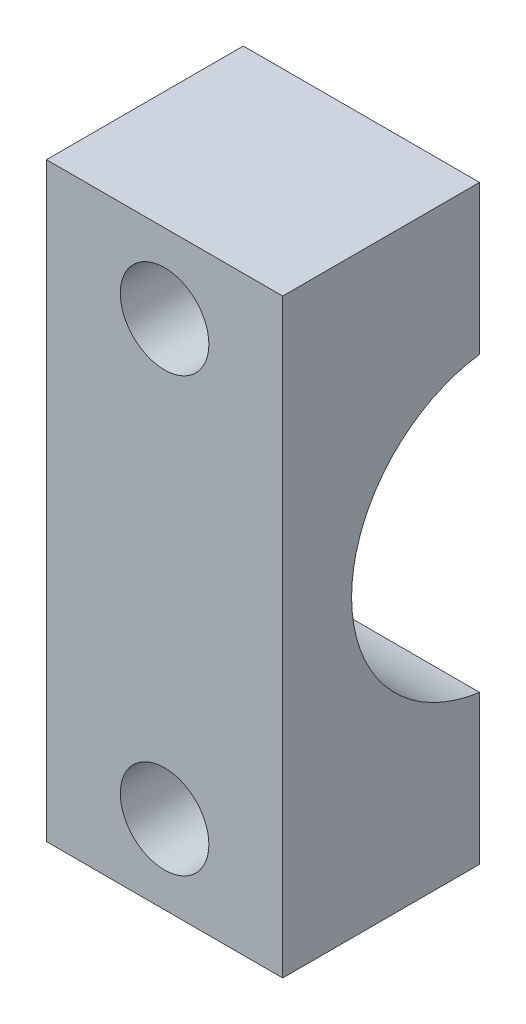
ISO-10303-21;
HEADER;
FILE_DESCRIPTION(('STEP AP214'),'2;1');
FILE_NAME('part.step','',(''),(''),'','','');
FILE_SCHEMA(('AUTOMOTIVE_DESIGN { 1 0 10303 214 1 1 1 1 }'));
ENDSEC;
DATA;
#1=APPLICATION_CONTEXT('core data for automotive mechanical design processes');
#2=APPLICATION_PROTOCOL_DEFINITION('international standard','automotive_design',2000,#1);
#3=PRODUCT_CONTEXT('',#1,'mechanical');
#4=PRODUCT('Part','Part','',(#3));
#5=PRODUCT_RELATED_PRODUCT_CATEGORY('part','',(#4));
#6=PRODUCT_DEFINITION_FORMATION('','',#4);
#7=PRODUCT_DEFINITION_CONTEXT('part definition',#1,'design');
#8=PRODUCT_DEFINITION('design','',#6,#7);
#9=PRODUCT_DEFINITION_SHAPE('','',#8);
#10=(LENGTH_UNIT() NAMED_UNIT(*) SI_UNIT(.MILLI.,.METRE.));
#11=(NAMED_UNIT(*) PLANE_ANGLE_UNIT() SI_UNIT($,.RADIAN.));
#12=(NAMED_UNIT(*) SI_UNIT($,.STERADIAN.) SOLID_ANGLE_UNIT());
#13=UNCERTAINTY_MEASURE_WITH_UNIT(LENGTH_MEASURE(1.E-05),#10,'distance_accuracy_value','');
#14=(GEOMETRIC_REPRESENTATION_CONTEXT(3) GLOBAL_UNCERTAINTY_ASSIGNED_CONTEXT((#13)) GLOBAL_UNIT_ASSIGNED_CONTEXT((#10,
#11,#12)) REPRESENTATION_CONTEXT('',''));
#15=CARTESIAN_POINT('',(0.,0.,0.));
#16=DIRECTION('',(0.,0.,1.));
#17=DIRECTION('',(1.,0.,0.));
#18=AXIS2_PLACEMENT_3D('',#15,#16,#17);
#19=CARTESIAN_POINT('',(-6.,0.,0.));
#20=DIRECTION('',(1.,0.,0.));
#21=DIRECTION('',(0.,0.,-1.));
#22=AXIS2_PLACEMENT_3D('',#19,#20,#21);
#23=CYLINDRICAL_SURFACE('',#22,7.5);
#24=CARTESIAN_POINT('',(6.,0.,0.));
#25=DIRECTION('',(-1.,0.,0.));
#26=DIRECTION('',(0.,0.,-1.));
#27=AXIS2_PLACEMENT_3D('',#24,#25,#26);
#28=CIRCLE('',#27,7.5);
#29=CARTESIAN_POINT('',(6.,-7.43303437365925,1.));
#30=VERTEX_POINT('',#29);
#31=CARTESIAN_POINT('',(6.,7.43303437365925,1.));
#32=VERTEX_POINT('',#31);
#33=EDGE_CURVE('E117',#30,#32,#28,.T.);
#34=ORIENTED_EDGE('',*,*,#33,.F.);
#35=DIRECTION('',(1.,0.,0.));
#36=VECTOR('',#35,1.);
#37=CARTESIAN_POINT('',(-6.,-7.43303437365925,1.));
#38=LINE('',#37,#36);
#39=CARTESIAN_POINT('',(-6.,-7.43303437365925,1.));
#40=VERTEX_POINT('',#39);
#41=EDGE_CURVE('E11',#40,#30,#38,.T.);
#42=ORIENTED_EDGE('',*,*,#41,.F.);
#43=CARTESIAN_POINT('',(-6.,0.,0.));
#44=DIRECTION('',(-1.,0.,0.));
#45=DIRECTION('',(0.,0.,-1.));
#46=AXIS2_PLACEMENT_3D('',#43,#44,#45);
#47=CIRCLE('',#46,7.5);
#48=CARTESIAN_POINT('',(-6.,7.43303437365925,1.));
#49=VERTEX_POINT('',#48);
#50=EDGE_CURVE('E132',#40,#49,#47,.T.);
#51=ORIENTED_EDGE('',*,*,#50,.T.);
#52=DIRECTION('',(1.,0.,0.));
#53=VECTOR('',#52,1.);
#54=CARTESIAN_POINT('',(-6.,7.43303437365925,1.));
#55=LINE('',#54,#53);
#56=EDGE_CURVE('E35',#49,#32,#55,.T.);
#57=ORIENTED_EDGE('',*,*,#56,.T.);
#58=EDGE_LOOP('',(#34,#42,#51,#57));
#59=FACE_BOUND('',#58,.T.);
#60=ADVANCED_FACE('F32',(#59),#23,.F.);
#61=CARTESIAN_POINT('',(-6.,-15.,1.));
#62=DIRECTION('',(0.,0.,-1.));
#63=DIRECTION('',(0.,1.,0.));
#64=AXIS2_PLACEMENT_3D('',#61,#62,#63);
#65=PLANE('',#64);
#66=CARTESIAN_POINT('',(0.,-11.,0.999999999999999));
#67=DIRECTION('',(0.,0.,1.));
#68=DIRECTION('',(1.,0.,0.));
#69=AXIS2_PLACEMENT_3D('',#66,#67,#68);
#70=CIRCLE('',#69,2.25);
#71=CARTESIAN_POINT('',(2.25,-11.,0.999999999999999));
#72=VERTEX_POINT('',#71);
#73=EDGE_CURVE('E170',#72,#72,#70,.T.);
#74=ORIENTED_EDGE('',*,*,#73,.T.);
#75=EDGE_LOOP('',(#74));
#76=FACE_BOUND('',#75,.T.);
#77=DIRECTION('',(0.,1.,0.));
#78=VECTOR('',#77,1.);
#79=CARTESIAN_POINT('',(6.,-15.,1.));
#80=LINE('',#79,#78);
#81=CARTESIAN_POINT('',(6.,-15.,1.));
#82=VERTEX_POINT('',#81);
#83=EDGE_CURVE('E130',#82,#30,#80,.T.);
#84=ORIENTED_EDGE('',*,*,#83,.F.);
#85=DIRECTION('',(1.,0.,0.));
#86=VECTOR('',#85,1.);
#87=CARTESIAN_POINT('',(-6.,-15.,1.));
#88=LINE('',#87,#86);
#89=CARTESIAN_POINT('',(-6.,-15.,1.));
#90=VERTEX_POINT('',#89);
#91=EDGE_CURVE('E41',#90,#82,#88,.T.);
#92=ORIENTED_EDGE('',*,*,#91,.F.);
#93=DIRECTION('',(0.,1.,0.));
#94=VECTOR('',#93,1.);
#95=CARTESIAN_POINT('',(-6.,-15.,1.));
#96=LINE('',#95,#94);
#97=EDGE_CURVE('E107',#90,#40,#96,.T.);
#98=ORIENTED_EDGE('',*,*,#97,.T.);
#99=ORIENTED_EDGE('',*,*,#41,.T.);
#100=EDGE_LOOP('',(#84,#92,#98,#99));
#101=FACE_BOUND('',#100,.T.);
#102=ADVANCED_FACE('F140',(#76,#101),#65,.T.);
#103=CARTESIAN_POINT('',(-6.,-15.,11.));
#104=DIRECTION('',(0.,-1.,0.));
#105=DIRECTION('',(0.,0.,-1.));
#106=AXIS2_PLACEMENT_3D('',#103,#104,#105);
#107=PLANE('',#106);
#108=DIRECTION('',(0.,0.,-1.));
#109=VECTOR('',#108,1.);
#110=CARTESIAN_POINT('',(6.,-15.,11.));
#111=LINE('',#110,#109);
#112=CARTESIAN_POINT('',(6.,-15.,11.));
#113=VERTEX_POINT('',#112);
#114=EDGE_CURVE('E94',#113,#82,#111,.T.);
#115=ORIENTED_EDGE('',*,*,#114,.F.);
#116=DIRECTION('',(1.,0.,0.));
#117=VECTOR('',#116,1.);
#118=CARTESIAN_POINT('',(-6.,-15.,11.));
#119=LINE('',#118,#117);
#120=CARTESIAN_POINT('',(-6.,-15.,11.));
#121=VERTEX_POINT('',#120);
#122=EDGE_CURVE('E89',#121,#113,#119,.T.);
#123=ORIENTED_EDGE('',*,*,#122,.F.);
#124=DIRECTION('',(0.,0.,-1.));
#125=VECTOR('',#124,1.);
#126=CARTESIAN_POINT('',(-6.,-15.,11.));
#127=LINE('',#126,#125);
#128=EDGE_CURVE('E92',#121,#90,#127,.T.);
#129=ORIENTED_EDGE('',*,*,#128,.T.);
#130=ORIENTED_EDGE('',*,*,#91,.T.);
#131=EDGE_LOOP('',(#115,#123,#129,#130));
#132=FACE_BOUND('',#131,.T.);
#133=ADVANCED_FACE('F91',(#132),#107,.T.);
#134=CARTESIAN_POINT('',(-6.,15.,11.));
#135=DIRECTION('',(0.,0.,1.));
#136=DIRECTION('',(1.,0.,0.));
#137=AXIS2_PLACEMENT_3D('',#134,#135,#136);
#138=PLANE('',#137);
#139=CARTESIAN_POINT('',(0.,-11.,11.));
#140=DIRECTION('',(0.,0.,1.));
#141=DIRECTION('',(1.,0.,0.));
#142=AXIS2_PLACEMENT_3D('',#139,#140,#141);
#143=CIRCLE('',#142,2.25);
#144=CARTESIAN_POINT('',(2.25,-11.,11.));
#145=VERTEX_POINT('',#144);
#146=EDGE_CURVE('E173',#145,#145,#143,.T.);
#147=ORIENTED_EDGE('',*,*,#146,.F.);
#148=EDGE_LOOP('',(#147));
#149=FACE_BOUND('',#148,.T.);
#150=CARTESIAN_POINT('',(0.,11.,11.));
#151=DIRECTION('',(0.,0.,1.));
#152=DIRECTION('',(1.,0.,0.));
#153=AXIS2_PLACEMENT_3D('',#150,#151,#152);
#154=CIRCLE('',#153,2.25);
#155=CARTESIAN_POINT('',(2.25,11.,11.));
#156=VERTEX_POINT('',#155);
#157=EDGE_CURVE('E167',#156,#156,#154,.T.);
#158=ORIENTED_EDGE('',*,*,#157,.F.);
#159=EDGE_LOOP('',(#158));
#160=FACE_BOUND('',#159,.T.);
#161=DIRECTION('',(0.,-1.,0.));
#162=VECTOR('',#161,1.);
#163=CARTESIAN_POINT('',(6.,15.,11.));
#164=LINE('',#163,#162);
#165=CARTESIAN_POINT('',(6.,15.,11.));
#166=VERTEX_POINT('',#165);
#167=EDGE_CURVE('E127',#166,#113,#164,.T.);
#168=ORIENTED_EDGE('',*,*,#167,.F.);
#169=DIRECTION('',(1.,0.,0.));
#170=VECTOR('',#169,1.);
#171=CARTESIAN_POINT('',(-6.,15.,11.));
#172=LINE('',#171,#170);
#173=CARTESIAN_POINT('',(-6.,15.,11.));
#174=VERTEX_POINT('',#173);
#175=EDGE_CURVE('E99',#174,#166,#172,.T.);
#176=ORIENTED_EDGE('',*,*,#175,.F.);
#177=DIRECTION('',(0.,-1.,0.));
#178=VECTOR('',#177,1.);
#179=CARTESIAN_POINT('',(-6.,15.,11.));
#180=LINE('',#179,#178);
#181=EDGE_CURVE('E105',#174,#121,#180,.T.);
#182=ORIENTED_EDGE('',*,*,#181,.T.);
#183=ORIENTED_EDGE('',*,*,#122,.T.);
#184=EDGE_LOOP('',(#168,#176,#182,#183));
#185=FACE_BOUND('',#184,.T.);
#186=ADVANCED_FACE('F109',(#149,#160,#185),#138,.T.);
#187=CARTESIAN_POINT('',(-6.,15.,1.));
#188=DIRECTION('',(0.,1.,0.));
#189=DIRECTION('',(0.,0.,1.));
#190=AXIS2_PLACEMENT_3D('',#187,#188,#189);
#191=PLANE('',#190);
#192=DIRECTION('',(0.,0.,1.));
#193=VECTOR('',#192,1.);
#194=CARTESIAN_POINT('',(6.,15.,1.));
#195=LINE('',#194,#193);
#196=CARTESIAN_POINT('',(6.,15.,1.));
#197=VERTEX_POINT('',#196);
#198=EDGE_CURVE('E124',#197,#166,#195,.T.);
#199=ORIENTED_EDGE('',*,*,#198,.F.);
#200=DIRECTION('',(1.,0.,0.));
#201=VECTOR('',#200,1.);
#202=CARTESIAN_POINT('',(-6.,15.,1.));
#203=LINE('',#202,#201);
#204=CARTESIAN_POINT('',(-6.,15.,1.));
#205=VERTEX_POINT('',#204);
#206=EDGE_CURVE('E135',#205,#197,#203,.T.);
#207=ORIENTED_EDGE('',*,*,#206,.F.);
#208=DIRECTION('',(0.,0.,1.));
#209=VECTOR('',#208,1.);
#210=CARTESIAN_POINT('',(-6.,15.,1.));
#211=LINE('',#210,#209);
#212=EDGE_CURVE('E110',#205,#174,#211,.T.);
#213=ORIENTED_EDGE('',*,*,#212,.T.);
#214=ORIENTED_EDGE('',*,*,#175,.T.);
#215=EDGE_LOOP('',(#199,#207,#213,#214));
#216=FACE_BOUND('',#215,.T.);
#217=ADVANCED_FACE('F155',(#216),#191,.T.);
#218=CARTESIAN_POINT('',(-6.,7.43303437365925,1.));
#219=DIRECTION('',(0.,0.,-1.));
#220=DIRECTION('',(0.,1.,0.));
#221=AXIS2_PLACEMENT_3D('',#218,#219,#220);
#222=PLANE('',#221);
#223=CARTESIAN_POINT('',(0.,11.,0.999999999999999));
#224=DIRECTION('',(0.,0.,1.));
#225=DIRECTION('',(1.,0.,0.));
#226=AXIS2_PLACEMENT_3D('',#223,#224,#225);
#227=CIRCLE('',#226,2.25);
#228=CARTESIAN_POINT('',(2.25,11.,0.999999999999999));
#229=VERTEX_POINT('',#228);
#230=EDGE_CURVE('E121',#229,#229,#227,.T.);
#231=ORIENTED_EDGE('',*,*,#230,.T.);
#232=EDGE_LOOP('',(#231));
#233=FACE_BOUND('',#232,.T.);
#234=DIRECTION('',(0.,1.,0.));
#235=VECTOR('',#234,1.);
#236=CARTESIAN_POINT('',(6.,7.43303437365925,1.));
#237=LINE('',#236,#235);
#238=EDGE_CURVE('E120',#32,#197,#237,.T.);
#239=ORIENTED_EDGE('',*,*,#238,.F.);
#240=ORIENTED_EDGE('',*,*,#56,.F.);
#241=DIRECTION('',(0.,1.,0.));
#242=VECTOR('',#241,1.);
#243=CARTESIAN_POINT('',(-6.,7.43303437365925,1.));
#244=LINE('',#243,#242);
#245=EDGE_CURVE('E112',#49,#205,#244,.T.);
#246=ORIENTED_EDGE('',*,*,#245,.T.);
#247=ORIENTED_EDGE('',*,*,#206,.T.);
#248=EDGE_LOOP('',(#239,#240,#246,#247));
#249=FACE_BOUND('',#248,.T.);
#250=ADVANCED_FACE('F137',(#233,#249),#222,.T.);
#251=CARTESIAN_POINT('',(-6.,0.,0.));
#252=DIRECTION('',(1.,0.,0.));
#253=DIRECTION('',(0.,0.,-1.));
#254=AXIS2_PLACEMENT_3D('',#251,#252,#253);
#255=PLANE('',#254);
#256=ORIENTED_EDGE('',*,*,#50,.F.);
#257=ORIENTED_EDGE('',*,*,#97,.F.);
#258=ORIENTED_EDGE('',*,*,#128,.F.);
#259=ORIENTED_EDGE('',*,*,#181,.F.);
#260=ORIENTED_EDGE('',*,*,#212,.F.);
#261=ORIENTED_EDGE('',*,*,#245,.F.);
#262=EDGE_LOOP('',(#256,#257,#258,#259,#260,#261));
#263=FACE_BOUND('',#262,.T.);
#264=ADVANCED_FACE('F103',(#263),#255,.F.);
#265=CARTESIAN_POINT('',(6.,0.,0.));
#266=DIRECTION('',(1.,0.,0.));
#267=DIRECTION('',(0.,0.,-1.));
#268=AXIS2_PLACEMENT_3D('',#265,#266,#267);
#269=PLANE('',#268);
#270=ORIENTED_EDGE('',*,*,#33,.T.);
#271=ORIENTED_EDGE('',*,*,#238,.T.);
#272=ORIENTED_EDGE('',*,*,#198,.T.);
#273=ORIENTED_EDGE('',*,*,#167,.T.);
#274=ORIENTED_EDGE('',*,*,#114,.T.);
#275=ORIENTED_EDGE('',*,*,#83,.T.);
#276=EDGE_LOOP('',(#270,#271,#272,#273,#274,#275));
#277=FACE_BOUND('',#276,.T.);
#278=ADVANCED_FACE('F139',(#277),#269,.T.);
#279=CARTESIAN_POINT('',(0.,11.,0.999999999999999));
#280=DIRECTION('',(0.,0.,1.));
#281=DIRECTION('',(1.,0.,0.));
#282=AXIS2_PLACEMENT_3D('',#279,#280,#281);
#283=CYLINDRICAL_SURFACE('',#282,2.25);
#284=ORIENTED_EDGE('',*,*,#230,.F.);
#285=EDGE_LOOP('',(#284));
#286=FACE_BOUND('',#285,.T.);
#287=ORIENTED_EDGE('',*,*,#157,.T.);
#288=EDGE_LOOP('',(#287));
#289=FACE_BOUND('',#288,.T.);
#290=ADVANCED_FACE('F182',(#286,#289),#283,.F.);
#291=CARTESIAN_POINT('',(0.,-11.,0.999999999999999));
#292=DIRECTION('',(0.,0.,1.));
#293=DIRECTION('',(1.,0.,0.));
#294=AXIS2_PLACEMENT_3D('',#291,#292,#293);
#295=CYLINDRICAL_SURFACE('',#294,2.25);
#296=ORIENTED_EDGE('',*,*,#73,.F.);
#297=EDGE_LOOP('',(#296));
#298=FACE_BOUND('',#297,.T.);
#299=ORIENTED_EDGE('',*,*,#146,.T.);
#300=EDGE_LOOP('',(#299));
#301=FACE_BOUND('',#300,.T.);
#302=ADVANCED_FACE('F179',(#298,#301),#295,.F.);
#303=CLOSED_SHELL('',(#60,#102,#133,#186,#217,#250,#264,#278,#290,#302));
#304=MANIFOLD_SOLID_BREP('B2',#303);
#305=ADVANCED_BREP_SHAPE_REPRESENTATION('',(#18,#304),#14);
#306=SHAPE_DEFINITION_REPRESENTATION(#9,#305);
ENDSEC;
END-ISO-10303-21;
